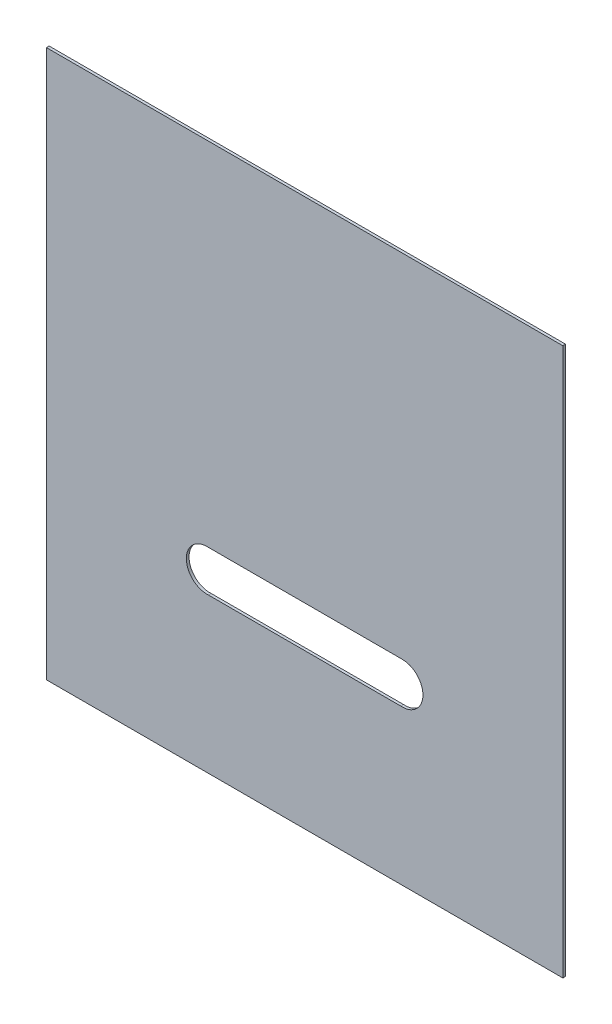
ISO-10303-21;
HEADER;
FILE_DESCRIPTION(('STEP AP214'),'2;1');
FILE_NAME('part.step','',(''),(''),'','','');
FILE_SCHEMA(('AUTOMOTIVE_DESIGN { 1 0 10303 214 1 1 1 1 }'));
ENDSEC;
DATA;
#1=APPLICATION_CONTEXT('core data for automotive mechanical design processes');
#2=APPLICATION_PROTOCOL_DEFINITION('international standard','automotive_design',2000,#1);
#3=PRODUCT_CONTEXT('',#1,'mechanical');
#4=PRODUCT('Part','Part','',(#3));
#5=PRODUCT_RELATED_PRODUCT_CATEGORY('part','',(#4));
#6=PRODUCT_DEFINITION_FORMATION('','',#4);
#7=PRODUCT_DEFINITION_CONTEXT('part definition',#1,'design');
#8=PRODUCT_DEFINITION('design','',#6,#7);
#9=PRODUCT_DEFINITION_SHAPE('','',#8);
#10=(LENGTH_UNIT() NAMED_UNIT(*) SI_UNIT(.MILLI.,.METRE.));
#11=(NAMED_UNIT(*) PLANE_ANGLE_UNIT() SI_UNIT($,.RADIAN.));
#12=(NAMED_UNIT(*) SI_UNIT($,.STERADIAN.) SOLID_ANGLE_UNIT());
#13=UNCERTAINTY_MEASURE_WITH_UNIT(LENGTH_MEASURE(1.E-05),#10,'distance_accuracy_value','');
#14=(GEOMETRIC_REPRESENTATION_CONTEXT(3) GLOBAL_UNCERTAINTY_ASSIGNED_CONTEXT((#13)) GLOBAL_UNIT_ASSIGNED_CONTEXT((#10,
#11,#12)) REPRESENTATION_CONTEXT('',''));
#15=CARTESIAN_POINT('',(0.,0.,0.));
#16=DIRECTION('',(0.,0.,1.));
#17=DIRECTION('',(1.,0.,0.));
#18=AXIS2_PLACEMENT_3D('',#15,#16,#17);
#19=CARTESIAN_POINT('',(-191.,-180.,2.));
#20=DIRECTION('',(-1.,0.,0.));
#21=DIRECTION('',(0.,0.,1.));
#22=AXIS2_PLACEMENT_3D('',#19,#20,#21);
#23=PLANE('',#22);
#24=DIRECTION('',(0.,1.,0.));
#25=VECTOR('',#24,1.);
#26=CARTESIAN_POINT('',(-191.,-180.,0.));
#27=LINE('',#26,#25);
#28=CARTESIAN_POINT('',(-191.,-180.,0.));
#29=VERTEX_POINT('',#28);
#30=CARTESIAN_POINT('',(-191.,225.,0.));
#31=VERTEX_POINT('',#30);
#32=EDGE_CURVE('E148',#29,#31,#27,.T.);
#33=ORIENTED_EDGE('',*,*,#32,.F.);
#34=DIRECTION('',(0.,0.,-1.));
#35=VECTOR('',#34,1.);
#36=CARTESIAN_POINT('',(-191.,-180.,2.));
#37=LINE('',#36,#35);
#38=CARTESIAN_POINT('',(-191.,-180.,2.));
#39=VERTEX_POINT('',#38);
#40=EDGE_CURVE('E11',#39,#29,#37,.T.);
#41=ORIENTED_EDGE('',*,*,#40,.F.);
#42=DIRECTION('',(0.,1.,0.));
#43=VECTOR('',#42,1.);
#44=CARTESIAN_POINT('',(-191.,-180.,2.));
#45=LINE('',#44,#43);
#46=CARTESIAN_POINT('',(-191.,225.,2.));
#47=VERTEX_POINT('',#46);
#48=EDGE_CURVE('E154',#39,#47,#45,.T.);
#49=ORIENTED_EDGE('',*,*,#48,.T.);
#50=DIRECTION('',(0.,0.,-1.));
#51=VECTOR('',#50,1.);
#52=CARTESIAN_POINT('',(-191.,225.,2.));
#53=LINE('',#52,#51);
#54=EDGE_CURVE('E44',#47,#31,#53,.T.);
#55=ORIENTED_EDGE('',*,*,#54,.T.);
#56=EDGE_LOOP('',(#33,#41,#49,#55));
#57=FACE_BOUND('',#56,.T.);
#58=ADVANCED_FACE('F41',(#57),#23,.T.);
#59=CARTESIAN_POINT('',(191.,-180.,2.));
#60=DIRECTION('',(0.,-1.,0.));
#61=DIRECTION('',(0.,0.,-1.));
#62=AXIS2_PLACEMENT_3D('',#59,#60,#61);
#63=PLANE('',#62);
#64=DIRECTION('',(-1.,0.,0.));
#65=VECTOR('',#64,1.);
#66=CARTESIAN_POINT('',(191.,-180.,0.));
#67=LINE('',#66,#65);
#68=CARTESIAN_POINT('',(191.,-180.,0.));
#69=VERTEX_POINT('',#68);
#70=EDGE_CURVE('E159',#69,#29,#67,.T.);
#71=ORIENTED_EDGE('',*,*,#70,.F.);
#72=DIRECTION('',(0.,0.,-1.));
#73=VECTOR('',#72,1.);
#74=CARTESIAN_POINT('',(191.,-180.,2.));
#75=LINE('',#74,#73);
#76=CARTESIAN_POINT('',(191.,-180.,2.));
#77=VERTEX_POINT('',#76);
#78=EDGE_CURVE('E50',#77,#69,#75,.T.);
#79=ORIENTED_EDGE('',*,*,#78,.F.);
#80=DIRECTION('',(-1.,0.,0.));
#81=VECTOR('',#80,1.);
#82=CARTESIAN_POINT('',(191.,-180.,2.));
#83=LINE('',#82,#81);
#84=EDGE_CURVE('E167',#77,#39,#83,.T.);
#85=ORIENTED_EDGE('',*,*,#84,.T.);
#86=ORIENTED_EDGE('',*,*,#40,.T.);
#87=EDGE_LOOP('',(#71,#79,#85,#86));
#88=FACE_BOUND('',#87,.T.);
#89=ADVANCED_FACE('F199',(#88),#63,.T.);
#90=CARTESIAN_POINT('',(191.,225.,2.));
#91=DIRECTION('',(1.,0.,0.));
#92=DIRECTION('',(0.,0.,-1.));
#93=AXIS2_PLACEMENT_3D('',#90,#91,#92);
#94=PLANE('',#93);
#95=DIRECTION('',(0.,-1.,0.));
#96=VECTOR('',#95,1.);
#97=CARTESIAN_POINT('',(191.,225.,0.));
#98=LINE('',#97,#96);
#99=CARTESIAN_POINT('',(191.,225.,0.));
#100=VERTEX_POINT('',#99);
#101=EDGE_CURVE('E178',#100,#69,#98,.T.);
#102=ORIENTED_EDGE('',*,*,#101,.F.);
#103=DIRECTION('',(0.,0.,-1.));
#104=VECTOR('',#103,1.);
#105=CARTESIAN_POINT('',(191.,225.,2.));
#106=LINE('',#105,#104);
#107=CARTESIAN_POINT('',(191.,225.,2.));
#108=VERTEX_POINT('',#107);
#109=EDGE_CURVE('E186',#108,#100,#106,.T.);
#110=ORIENTED_EDGE('',*,*,#109,.F.);
#111=DIRECTION('',(0.,-1.,0.));
#112=VECTOR('',#111,1.);
#113=CARTESIAN_POINT('',(191.,225.,2.));
#114=LINE('',#113,#112);
#115=EDGE_CURVE('E163',#108,#77,#114,.T.);
#116=ORIENTED_EDGE('',*,*,#115,.T.);
#117=ORIENTED_EDGE('',*,*,#78,.T.);
#118=EDGE_LOOP('',(#102,#110,#116,#117));
#119=FACE_BOUND('',#118,.T.);
#120=ADVANCED_FACE('F205',(#119),#94,.T.);
#121=CARTESIAN_POINT('',(-191.,225.,2.));
#122=DIRECTION('',(0.,1.,0.));
#123=DIRECTION('',(0.,0.,1.));
#124=AXIS2_PLACEMENT_3D('',#121,#122,#123);
#125=PLANE('',#124);
#126=DIRECTION('',(1.,0.,0.));
#127=VECTOR('',#126,1.);
#128=CARTESIAN_POINT('',(-191.,225.,0.));
#129=LINE('',#128,#127);
#130=EDGE_CURVE('E174',#31,#100,#129,.T.);
#131=ORIENTED_EDGE('',*,*,#130,.F.);
#132=ORIENTED_EDGE('',*,*,#54,.F.);
#133=DIRECTION('',(1.,0.,0.));
#134=VECTOR('',#133,1.);
#135=CARTESIAN_POINT('',(-191.,225.,2.));
#136=LINE('',#135,#134);
#137=EDGE_CURVE('E158',#47,#108,#136,.T.);
#138=ORIENTED_EDGE('',*,*,#137,.T.);
#139=ORIENTED_EDGE('',*,*,#109,.T.);
#140=EDGE_LOOP('',(#131,#132,#138,#139));
#141=FACE_BOUND('',#140,.T.);
#142=ADVANCED_FACE('F196',(#141),#125,.T.);
#143=CARTESIAN_POINT('',(0.,0.,2.));
#144=DIRECTION('',(0.,0.,-1.));
#145=DIRECTION('',(-1.,0.,0.));
#146=AXIS2_PLACEMENT_3D('',#143,#144,#145);
#147=PLANE('',#146);
#148=CARTESIAN_POINT('',(72.225,-50.52,2.));
#149=DIRECTION('',(0.,0.,1.));
#150=DIRECTION('',(1.,0.,0.));
#151=AXIS2_PLACEMENT_3D('',#148,#149,#150);
#152=CIRCLE('',#151,15.27);
#153=CARTESIAN_POINT('',(71.1204638982815,-65.75,2.));
#154=VERTEX_POINT('',#153);
#155=CARTESIAN_POINT('',(72.225,-35.25,2.));
#156=VERTEX_POINT('',#155);
#157=EDGE_CURVE('E139',#154,#156,#152,.T.);
#158=ORIENTED_EDGE('',*,*,#157,.F.);
#159=DIRECTION('',(1.,0.,0.));
#160=VECTOR('',#159,1.);
#161=CARTESIAN_POINT('',(0.,-65.75,2.));
#162=LINE('',#161,#160);
#163=CARTESIAN_POINT('',(-71.1204638982813,-65.75,2.));
#164=VERTEX_POINT('',#163);
#165=EDGE_CURVE('E58',#164,#154,#162,.T.);
#166=ORIENTED_EDGE('',*,*,#165,.F.);
#167=CARTESIAN_POINT('',(-72.225,-50.52,2.));
#168=DIRECTION('',(0.,0.,1.));
#169=DIRECTION('',(1.,0.,0.));
#170=AXIS2_PLACEMENT_3D('',#167,#168,#169);
#171=CIRCLE('',#170,15.27);
#172=CARTESIAN_POINT('',(-72.225,-35.25,2.));
#173=VERTEX_POINT('',#172);
#174=EDGE_CURVE('E126',#164,#173,#171,.F.);
#175=ORIENTED_EDGE('',*,*,#174,.T.);
#176=DIRECTION('',(1.,0.,0.));
#177=VECTOR('',#176,1.);
#178=CARTESIAN_POINT('',(0.,-35.25,2.));
#179=LINE('',#178,#177);
#180=EDGE_CURVE('E130',#173,#156,#179,.T.);
#181=ORIENTED_EDGE('',*,*,#180,.T.);
#182=EDGE_LOOP('',(#158,#166,#175,#181));
#183=FACE_BOUND('',#182,.T.);
#184=ORIENTED_EDGE('',*,*,#48,.F.);
#185=ORIENTED_EDGE('',*,*,#84,.F.);
#186=ORIENTED_EDGE('',*,*,#115,.F.);
#187=ORIENTED_EDGE('',*,*,#137,.F.);
#188=EDGE_LOOP('',(#184,#185,#186,#187));
#189=FACE_BOUND('',#188,.T.);
#190=ADVANCED_FACE('F202',(#183,#189),#147,.F.);
#191=CARTESIAN_POINT('',(0.,0.,0.));
#192=DIRECTION('',(0.,0.,-1.));
#193=DIRECTION('',(-1.,0.,0.));
#194=AXIS2_PLACEMENT_3D('',#191,#192,#193);
#195=PLANE('',#194);
#196=DIRECTION('',(1.,0.,0.));
#197=VECTOR('',#196,1.);
#198=CARTESIAN_POINT('',(0.,-65.75,0.));
#199=LINE('',#198,#197);
#200=CARTESIAN_POINT('',(-71.1204638982813,-65.75,0.));
#201=VERTEX_POINT('',#200);
#202=CARTESIAN_POINT('',(71.1204638982815,-65.75,0.));
#203=VERTEX_POINT('',#202);
#204=EDGE_CURVE('E109',#201,#203,#199,.T.);
#205=ORIENTED_EDGE('',*,*,#204,.T.);
#206=CARTESIAN_POINT('',(72.225,-50.52,0.));
#207=DIRECTION('',(0.,0.,1.));
#208=DIRECTION('',(1.,0.,0.));
#209=AXIS2_PLACEMENT_3D('',#206,#207,#208);
#210=CIRCLE('',#209,15.27);
#211=CARTESIAN_POINT('',(72.225,-35.25,0.));
#212=VERTEX_POINT('',#211);
#213=EDGE_CURVE('E116',#203,#212,#210,.T.);
#214=ORIENTED_EDGE('',*,*,#213,.T.);
#215=DIRECTION('',(1.,0.,0.));
#216=VECTOR('',#215,1.);
#217=CARTESIAN_POINT('',(0.,-35.25,0.));
#218=LINE('',#217,#216);
#219=CARTESIAN_POINT('',(-72.225,-35.25,0.));
#220=VERTEX_POINT('',#219);
#221=EDGE_CURVE('E121',#220,#212,#218,.T.);
#222=ORIENTED_EDGE('',*,*,#221,.F.);
#223=CARTESIAN_POINT('',(-72.225,-50.52,0.));
#224=DIRECTION('',(0.,0.,1.));
#225=DIRECTION('',(1.,0.,0.));
#226=AXIS2_PLACEMENT_3D('',#223,#224,#225);
#227=CIRCLE('',#226,15.27);
#228=EDGE_CURVE('E113',#201,#220,#227,.F.);
#229=ORIENTED_EDGE('',*,*,#228,.F.);
#230=EDGE_LOOP('',(#205,#214,#222,#229));
#231=FACE_BOUND('',#230,.T.);
#232=ORIENTED_EDGE('',*,*,#32,.T.);
#233=ORIENTED_EDGE('',*,*,#130,.T.);
#234=ORIENTED_EDGE('',*,*,#101,.T.);
#235=ORIENTED_EDGE('',*,*,#70,.T.);
#236=EDGE_LOOP('',(#232,#233,#234,#235));
#237=FACE_BOUND('',#236,.T.);
#238=ADVANCED_FACE('F123',(#231,#237),#195,.T.);
#239=CARTESIAN_POINT('',(0.,-65.75,0.));
#240=DIRECTION('',(0.,-1.,0.));
#241=DIRECTION('',(0.,0.,-1.));
#242=AXIS2_PLACEMENT_3D('',#239,#240,#241);
#243=PLANE('',#242);
#244=ORIENTED_EDGE('',*,*,#165,.T.);
#245=DIRECTION('',(0.,0.,1.));
#246=VECTOR('',#245,1.);
#247=CARTESIAN_POINT('',(71.1204638982815,-65.75,0.));
#248=LINE('',#247,#246);
#249=EDGE_CURVE('E106',#203,#154,#248,.T.);
#250=ORIENTED_EDGE('',*,*,#249,.F.);
#251=ORIENTED_EDGE('',*,*,#204,.F.);
#252=DIRECTION('',(0.,0.,1.));
#253=VECTOR('',#252,1.);
#254=CARTESIAN_POINT('',(-71.1204638982813,-65.75,0.));
#255=LINE('',#254,#253);
#256=EDGE_CURVE('E145',#201,#164,#255,.T.);
#257=ORIENTED_EDGE('',*,*,#256,.T.);
#258=EDGE_LOOP('',(#244,#250,#251,#257));
#259=FACE_BOUND('',#258,.T.);
#260=ADVANCED_FACE('F107',(#259),#243,.F.);
#261=CARTESIAN_POINT('',(-72.225,-50.52,0.));
#262=DIRECTION('',(0.,0.,1.));
#263=DIRECTION('',(1.,0.,0.));
#264=AXIS2_PLACEMENT_3D('',#261,#262,#263);
#265=CYLINDRICAL_SURFACE('',#264,15.27);
#266=ORIENTED_EDGE('',*,*,#174,.F.);
#267=ORIENTED_EDGE('',*,*,#256,.F.);
#268=ORIENTED_EDGE('',*,*,#228,.T.);
#269=DIRECTION('',(0.,0.,1.));
#270=VECTOR('',#269,1.);
#271=CARTESIAN_POINT('',(-72.225,-35.25,0.));
#272=LINE('',#271,#270);
#273=EDGE_CURVE('E149',#220,#173,#272,.T.);
#274=ORIENTED_EDGE('',*,*,#273,.T.);
#275=EDGE_LOOP('',(#266,#267,#268,#274));
#276=FACE_BOUND('',#275,.T.);
#277=ADVANCED_FACE('F256',(#276),#265,.F.);
#278=CARTESIAN_POINT('',(0.,-35.25,0.));
#279=DIRECTION('',(0.,-1.,0.));
#280=DIRECTION('',(1.,0.,0.));
#281=AXIS2_PLACEMENT_3D('',#278,#279,#280);
#282=PLANE('',#281);
#283=ORIENTED_EDGE('',*,*,#180,.F.);
#284=ORIENTED_EDGE('',*,*,#273,.F.);
#285=ORIENTED_EDGE('',*,*,#221,.T.);
#286=DIRECTION('',(0.,0.,1.));
#287=VECTOR('',#286,1.);
#288=CARTESIAN_POINT('',(72.225,-35.25,0.));
#289=LINE('',#288,#287);
#290=EDGE_CURVE('E66',#212,#156,#289,.T.);
#291=ORIENTED_EDGE('',*,*,#290,.T.);
#292=EDGE_LOOP('',(#283,#284,#285,#291));
#293=FACE_BOUND('',#292,.T.);
#294=ADVANCED_FACE('F265',(#293),#282,.T.);
#295=CARTESIAN_POINT('',(72.225,-50.52,0.));
#296=DIRECTION('',(0.,0.,1.));
#297=DIRECTION('',(1.,0.,0.));
#298=AXIS2_PLACEMENT_3D('',#295,#296,#297);
#299=CYLINDRICAL_SURFACE('',#298,15.27);
#300=ORIENTED_EDGE('',*,*,#157,.T.);
#301=ORIENTED_EDGE('',*,*,#290,.F.);
#302=ORIENTED_EDGE('',*,*,#213,.F.);
#303=ORIENTED_EDGE('',*,*,#249,.T.);
#304=EDGE_LOOP('',(#300,#301,#302,#303));
#305=FACE_BOUND('',#304,.T.);
#306=ADVANCED_FACE('F117',(#305),#299,.F.);
#307=CLOSED_SHELL('',(#58,#89,#120,#142,#190,#238,#260,#277,#294,#306));
#308=MANIFOLD_SOLID_BREP('B2',#307);
#309=ADVANCED_BREP_SHAPE_REPRESENTATION('',(#18,#308),#14);
#310=SHAPE_DEFINITION_REPRESENTATION(#9,#309);
ENDSEC;
END-ISO-10303-21;
